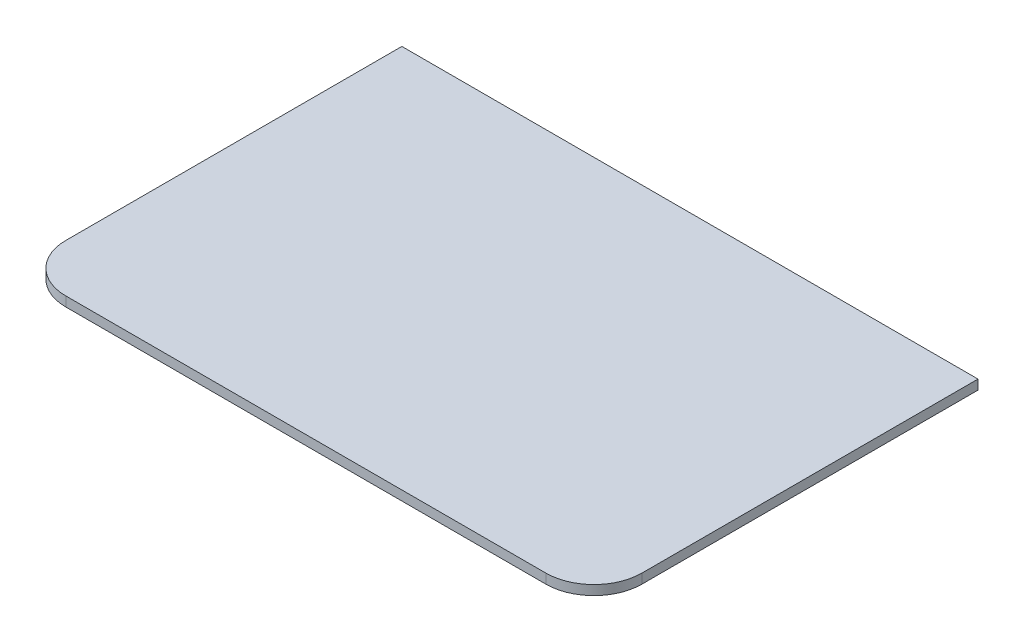
ISO-10303-21;
HEADER;
FILE_DESCRIPTION(('STEP AP214'),'2;1');
FILE_NAME('part.step','',(''),(''),'','','');
FILE_SCHEMA(('AUTOMOTIVE_DESIGN { 1 0 10303 214 1 1 1 1 }'));
ENDSEC;
DATA;
#1=APPLICATION_CONTEXT('core data for automotive mechanical design processes');
#2=APPLICATION_PROTOCOL_DEFINITION('international standard','automotive_design',2000,#1);
#3=PRODUCT_CONTEXT('',#1,'mechanical');
#4=PRODUCT('Part','Part','',(#3));
#5=PRODUCT_RELATED_PRODUCT_CATEGORY('part','',(#4));
#6=PRODUCT_DEFINITION_FORMATION('','',#4);
#7=PRODUCT_DEFINITION_CONTEXT('part definition',#1,'design');
#8=PRODUCT_DEFINITION('design','',#6,#7);
#9=PRODUCT_DEFINITION_SHAPE('','',#8);
#10=(LENGTH_UNIT() NAMED_UNIT(*) SI_UNIT(.MILLI.,.METRE.));
#11=(NAMED_UNIT(*) PLANE_ANGLE_UNIT() SI_UNIT($,.RADIAN.));
#12=(NAMED_UNIT(*) SI_UNIT($,.STERADIAN.) SOLID_ANGLE_UNIT());
#13=UNCERTAINTY_MEASURE_WITH_UNIT(LENGTH_MEASURE(1.E-05),#10,'distance_accuracy_value','');
#14=(GEOMETRIC_REPRESENTATION_CONTEXT(3) GLOBAL_UNCERTAINTY_ASSIGNED_CONTEXT((#13)) GLOBAL_UNIT_ASSIGNED_CONTEXT((#10,
#11,#12)) REPRESENTATION_CONTEXT('',''));
#15=CARTESIAN_POINT('',(0.,0.,0.));
#16=DIRECTION('',(0.,0.,1.));
#17=DIRECTION('',(1.,0.,0.));
#18=AXIS2_PLACEMENT_3D('',#15,#16,#17);
#19=CARTESIAN_POINT('',(60.,2.,-40.));
#20=DIRECTION('',(-1.,0.,0.));
#21=DIRECTION('',(0.,0.,1.));
#22=AXIS2_PLACEMENT_3D('',#19,#20,#21);
#23=PLANE('',#22);
#24=DIRECTION('',(0.,0.,-1.));
#25=VECTOR('',#24,1.);
#26=CARTESIAN_POINT('',(60.,2.,-40.));
#27=LINE('',#26,#25);
#28=CARTESIAN_POINT('',(60.,2.,30.));
#29=VERTEX_POINT('',#28);
#30=CARTESIAN_POINT('',(60.,2.,-40.));
#31=VERTEX_POINT('',#30);
#32=EDGE_CURVE('E87',#29,#31,#27,.T.);
#33=ORIENTED_EDGE('',*,*,#32,.F.);
#34=DIRECTION('',(0.,-1.,0.));
#35=VECTOR('',#34,1.);
#36=CARTESIAN_POINT('',(60.,2.,30.));
#37=LINE('',#36,#35);
#38=CARTESIAN_POINT('',(60.,0.,30.));
#39=VERTEX_POINT('',#38);
#40=EDGE_CURVE('E110',#29,#39,#37,.T.);
#41=ORIENTED_EDGE('',*,*,#40,.T.);
#42=DIRECTION('',(0.,0.,-1.));
#43=VECTOR('',#42,1.);
#44=CARTESIAN_POINT('',(60.,0.,-40.));
#45=LINE('',#44,#43);
#46=CARTESIAN_POINT('',(60.,0.,-40.));
#47=VERTEX_POINT('',#46);
#48=EDGE_CURVE('E108',#39,#47,#45,.T.);
#49=ORIENTED_EDGE('',*,*,#48,.T.);
#50=DIRECTION('',(0.,-1.,0.));
#51=VECTOR('',#50,1.);
#52=CARTESIAN_POINT('',(60.,2.,-40.));
#53=LINE('',#52,#51);
#54=EDGE_CURVE('E102',#31,#47,#53,.T.);
#55=ORIENTED_EDGE('',*,*,#54,.F.);
#56=EDGE_LOOP('',(#33,#41,#49,#55));
#57=FACE_BOUND('',#56,.T.);
#58=ADVANCED_FACE('F33',(#57),#23,.F.);
#59=CARTESIAN_POINT('',(-60.,2.,-40.));
#60=DIRECTION('',(0.,0.,1.));
#61=DIRECTION('',(1.,0.,0.));
#62=AXIS2_PLACEMENT_3D('',#59,#60,#61);
#63=PLANE('',#62);
#64=DIRECTION('',(-1.,0.,0.));
#65=VECTOR('',#64,1.);
#66=CARTESIAN_POINT('',(-60.,0.,-40.));
#67=LINE('',#66,#65);
#68=CARTESIAN_POINT('',(-60.,0.,-40.));
#69=VERTEX_POINT('',#68);
#70=EDGE_CURVE('E137',#47,#69,#67,.T.);
#71=ORIENTED_EDGE('',*,*,#70,.T.);
#72=DIRECTION('',(0.,-1.,0.));
#73=VECTOR('',#72,1.);
#74=CARTESIAN_POINT('',(-60.,2.,-40.));
#75=LINE('',#74,#73);
#76=CARTESIAN_POINT('',(-60.,2.,-40.));
#77=VERTEX_POINT('',#76);
#78=EDGE_CURVE('E104',#77,#69,#75,.T.);
#79=ORIENTED_EDGE('',*,*,#78,.F.);
#80=DIRECTION('',(-1.,0.,0.));
#81=VECTOR('',#80,1.);
#82=CARTESIAN_POINT('',(-60.,2.,-40.));
#83=LINE('',#82,#81);
#84=EDGE_CURVE('E90',#31,#77,#83,.T.);
#85=ORIENTED_EDGE('',*,*,#84,.F.);
#86=ORIENTED_EDGE('',*,*,#54,.T.);
#87=EDGE_LOOP('',(#71,#79,#85,#86));
#88=FACE_BOUND('',#87,.T.);
#89=ADVANCED_FACE('F101',(#88),#63,.F.);
#90=CARTESIAN_POINT('',(-60.,2.,-40.));
#91=DIRECTION('',(1.,0.,0.));
#92=DIRECTION('',(0.,0.,-1.));
#93=AXIS2_PLACEMENT_3D('',#90,#91,#92);
#94=PLANE('',#93);
#95=DIRECTION('',(0.,0.,1.));
#96=VECTOR('',#95,1.);
#97=CARTESIAN_POINT('',(-60.,0.,-40.));
#98=LINE('',#97,#96);
#99=CARTESIAN_POINT('',(-60.,0.,30.));
#100=VERTEX_POINT('',#99);
#101=EDGE_CURVE('E135',#69,#100,#98,.T.);
#102=ORIENTED_EDGE('',*,*,#101,.T.);
#103=DIRECTION('',(0.,-1.,0.));
#104=VECTOR('',#103,1.);
#105=CARTESIAN_POINT('',(-60.,2.,30.));
#106=LINE('',#105,#104);
#107=CARTESIAN_POINT('',(-60.,2.,30.));
#108=VERTEX_POINT('',#107);
#109=EDGE_CURVE('E11',#100,#108,#106,.F.);
#110=ORIENTED_EDGE('',*,*,#109,.T.);
#111=DIRECTION('',(0.,0.,1.));
#112=VECTOR('',#111,1.);
#113=CARTESIAN_POINT('',(-60.,2.,-40.));
#114=LINE('',#113,#112);
#115=EDGE_CURVE('E105',#77,#108,#114,.T.);
#116=ORIENTED_EDGE('',*,*,#115,.F.);
#117=ORIENTED_EDGE('',*,*,#78,.T.);
#118=EDGE_LOOP('',(#102,#110,#116,#117));
#119=FACE_BOUND('',#118,.T.);
#120=ADVANCED_FACE('F136',(#119),#94,.F.);
#121=CARTESIAN_POINT('',(-60.,2.,40.));
#122=DIRECTION('',(0.,0.,-1.));
#123=DIRECTION('',(-1.,0.,0.));
#124=AXIS2_PLACEMENT_3D('',#121,#122,#123);
#125=PLANE('',#124);
#126=DIRECTION('',(1.,0.,0.));
#127=VECTOR('',#126,1.);
#128=CARTESIAN_POINT('',(-60.,0.,40.));
#129=LINE('',#128,#127);
#130=CARTESIAN_POINT('',(-50.,0.,40.));
#131=VERTEX_POINT('',#130);
#132=CARTESIAN_POINT('',(50.,0.,40.));
#133=VERTEX_POINT('',#132);
#134=EDGE_CURVE('E97',#131,#133,#129,.T.);
#135=ORIENTED_EDGE('',*,*,#134,.T.);
#136=DIRECTION('',(0.,-1.,0.));
#137=VECTOR('',#136,1.);
#138=CARTESIAN_POINT('',(50.,2.,40.));
#139=LINE('',#138,#137);
#140=CARTESIAN_POINT('',(50.,2.,40.));
#141=VERTEX_POINT('',#140);
#142=EDGE_CURVE('E54',#133,#141,#139,.F.);
#143=ORIENTED_EDGE('',*,*,#142,.T.);
#144=DIRECTION('',(1.,0.,0.));
#145=VECTOR('',#144,1.);
#146=CARTESIAN_POINT('',(-60.,2.,40.));
#147=LINE('',#146,#145);
#148=CARTESIAN_POINT('',(-50.,2.,40.));
#149=VERTEX_POINT('',#148);
#150=EDGE_CURVE('E114',#149,#141,#147,.T.);
#151=ORIENTED_EDGE('',*,*,#150,.F.);
#152=DIRECTION('',(0.,-1.,0.));
#153=VECTOR('',#152,1.);
#154=CARTESIAN_POINT('',(-50.,2.,40.));
#155=LINE('',#154,#153);
#156=EDGE_CURVE('E121',#149,#131,#155,.T.);
#157=ORIENTED_EDGE('',*,*,#156,.T.);
#158=EDGE_LOOP('',(#135,#143,#151,#157));
#159=FACE_BOUND('',#158,.T.);
#160=ADVANCED_FACE('F129',(#159),#125,.F.);
#161=CARTESIAN_POINT('',(0.,2.,0.));
#162=DIRECTION('',(0.,1.,0.));
#163=DIRECTION('',(0.,0.,1.));
#164=AXIS2_PLACEMENT_3D('',#161,#162,#163);
#165=PLANE('',#164);
#166=ORIENTED_EDGE('',*,*,#150,.T.);
#167=CARTESIAN_POINT('',(50.,2.,30.));
#168=DIRECTION('',(0.,1.,0.));
#169=DIRECTION('',(0.,0.,1.));
#170=AXIS2_PLACEMENT_3D('',#167,#168,#169);
#171=CIRCLE('',#170,10.);
#172=EDGE_CURVE('E41',#141,#29,#171,.T.);
#173=ORIENTED_EDGE('',*,*,#172,.T.);
#174=ORIENTED_EDGE('',*,*,#32,.T.);
#175=ORIENTED_EDGE('',*,*,#84,.T.);
#176=ORIENTED_EDGE('',*,*,#115,.T.);
#177=CARTESIAN_POINT('',(-50.,2.,30.));
#178=DIRECTION('',(0.,1.,0.));
#179=DIRECTION('',(0.,0.,1.));
#180=AXIS2_PLACEMENT_3D('',#177,#178,#179);
#181=CIRCLE('',#180,10.);
#182=EDGE_CURVE('E125',#108,#149,#181,.T.);
#183=ORIENTED_EDGE('',*,*,#182,.T.);
#184=EDGE_LOOP('',(#166,#173,#174,#175,#176,#183));
#185=FACE_BOUND('',#184,.T.);
#186=ADVANCED_FACE('F89',(#185),#165,.T.);
#187=CARTESIAN_POINT('',(0.,0.,0.));
#188=DIRECTION('',(0.,1.,0.));
#189=DIRECTION('',(0.,0.,1.));
#190=AXIS2_PLACEMENT_3D('',#187,#188,#189);
#191=PLANE('',#190);
#192=ORIENTED_EDGE('',*,*,#48,.F.);
#193=CARTESIAN_POINT('',(50.,0.,30.));
#194=DIRECTION('',(0.,1.,0.));
#195=DIRECTION('',(0.,0.,1.));
#196=AXIS2_PLACEMENT_3D('',#193,#194,#195);
#197=CIRCLE('',#196,10.);
#198=EDGE_CURVE('E119',#39,#133,#197,.F.);
#199=ORIENTED_EDGE('',*,*,#198,.T.);
#200=ORIENTED_EDGE('',*,*,#134,.F.);
#201=CARTESIAN_POINT('',(-50.,0.,30.));
#202=DIRECTION('',(0.,1.,0.));
#203=DIRECTION('',(0.,0.,1.));
#204=AXIS2_PLACEMENT_3D('',#201,#202,#203);
#205=CIRCLE('',#204,10.);
#206=EDGE_CURVE('E112',#131,#100,#205,.F.);
#207=ORIENTED_EDGE('',*,*,#206,.T.);
#208=ORIENTED_EDGE('',*,*,#101,.F.);
#209=ORIENTED_EDGE('',*,*,#70,.F.);
#210=EDGE_LOOP('',(#192,#199,#200,#207,#208,#209));
#211=FACE_BOUND('',#210,.T.);
#212=ADVANCED_FACE('F134',(#211),#191,.F.);
#213=CARTESIAN_POINT('',(50.,2.,30.));
#214=DIRECTION('',(0.,-1.,0.));
#215=DIRECTION('',(0.,0.,-1.));
#216=AXIS2_PLACEMENT_3D('',#213,#214,#215);
#217=CYLINDRICAL_SURFACE('',#216,10.);
#218=ORIENTED_EDGE('',*,*,#172,.F.);
#219=ORIENTED_EDGE('',*,*,#142,.F.);
#220=ORIENTED_EDGE('',*,*,#198,.F.);
#221=ORIENTED_EDGE('',*,*,#40,.F.);
#222=EDGE_LOOP('',(#218,#219,#220,#221));
#223=FACE_BOUND('',#222,.T.);
#224=ADVANCED_FACE('F143',(#223),#217,.T.);
#225=CARTESIAN_POINT('',(-50.,2.,30.));
#226=DIRECTION('',(0.,-1.,0.));
#227=DIRECTION('',(0.,0.,-1.));
#228=AXIS2_PLACEMENT_3D('',#225,#226,#227);
#229=CYLINDRICAL_SURFACE('',#228,10.);
#230=ORIENTED_EDGE('',*,*,#182,.F.);
#231=ORIENTED_EDGE('',*,*,#109,.F.);
#232=ORIENTED_EDGE('',*,*,#206,.F.);
#233=ORIENTED_EDGE('',*,*,#156,.F.);
#234=EDGE_LOOP('',(#230,#231,#232,#233));
#235=FACE_BOUND('',#234,.T.);
#236=ADVANCED_FACE('F35',(#235),#229,.T.);
#237=CLOSED_SHELL('',(#58,#89,#120,#160,#186,#212,#224,#236));
#238=MANIFOLD_SOLID_BREP('B2',#237);
#239=ADVANCED_BREP_SHAPE_REPRESENTATION('',(#18,#238),#14);
#240=SHAPE_DEFINITION_REPRESENTATION(#9,#239);
ENDSEC;
END-ISO-10303-21;
